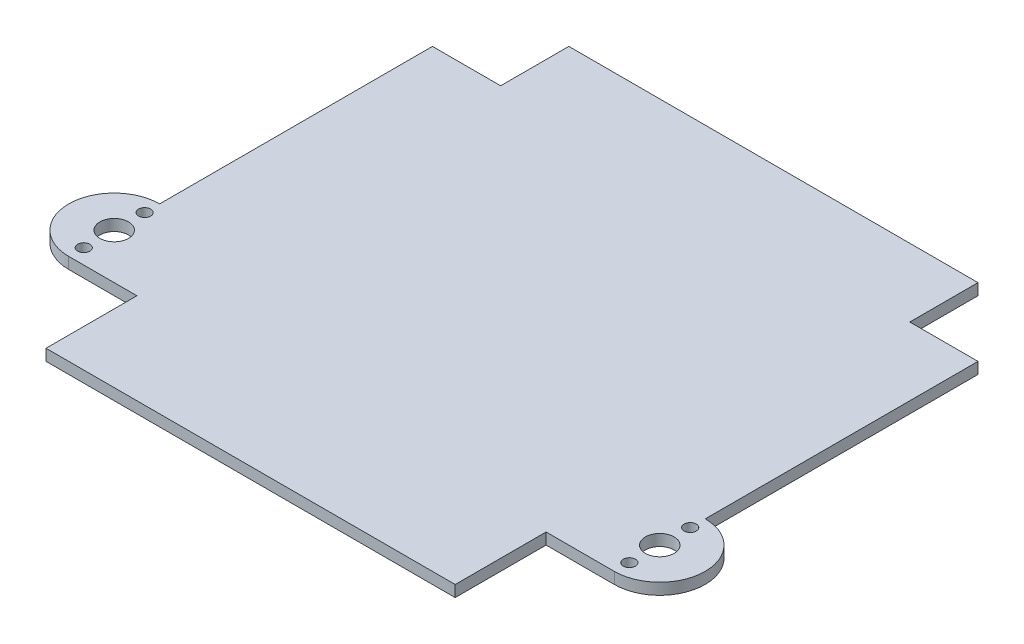
ISO-10303-21;
HEADER;
FILE_DESCRIPTION(('STEP AP214'),'2;1');
FILE_NAME('part.step','',(''),(''),'','','');
FILE_SCHEMA(('AUTOMOTIVE_DESIGN { 1 0 10303 214 1 1 1 1 }'));
ENDSEC;
DATA;
#1=APPLICATION_CONTEXT('core data for automotive mechanical design processes');
#2=APPLICATION_PROTOCOL_DEFINITION('international standard','automotive_design',2000,#1);
#3=PRODUCT_CONTEXT('',#1,'mechanical');
#4=PRODUCT('Part','Part','',(#3));
#5=PRODUCT_RELATED_PRODUCT_CATEGORY('part','',(#4));
#6=PRODUCT_DEFINITION_FORMATION('','',#4);
#7=PRODUCT_DEFINITION_CONTEXT('part definition',#1,'design');
#8=PRODUCT_DEFINITION('design','',#6,#7);
#9=PRODUCT_DEFINITION_SHAPE('','',#8);
#10=(LENGTH_UNIT() NAMED_UNIT(*) SI_UNIT(.MILLI.,.METRE.));
#11=(NAMED_UNIT(*) PLANE_ANGLE_UNIT() SI_UNIT($,.RADIAN.));
#12=(NAMED_UNIT(*) SI_UNIT($,.STERADIAN.) SOLID_ANGLE_UNIT());
#13=UNCERTAINTY_MEASURE_WITH_UNIT(LENGTH_MEASURE(1.E-05),#10,'distance_accuracy_value','');
#14=(GEOMETRIC_REPRESENTATION_CONTEXT(3) GLOBAL_UNCERTAINTY_ASSIGNED_CONTEXT((#13)) GLOBAL_UNIT_ASSIGNED_CONTEXT((#10,
#11,#12)) REPRESENTATION_CONTEXT('',''));
#15=CARTESIAN_POINT('',(0.,0.,0.));
#16=DIRECTION('',(0.,0.,1.));
#17=DIRECTION('',(1.,0.,0.));
#18=AXIS2_PLACEMENT_3D('',#15,#16,#17);
#19=CARTESIAN_POINT('',(0.,3.175,0.));
#20=DIRECTION('',(0.,-1.,0.));
#21=DIRECTION('',(0.,0.,-1.));
#22=AXIS2_PLACEMENT_3D('',#19,#20,#21);
#23=PLANE('',#22);
#24=CARTESIAN_POINT('',(-76.2,3.175,29.6));
#25=DIRECTION('',(0.,1.,0.));
#26=DIRECTION('',(0.,0.,1.));
#27=AXIS2_PLACEMENT_3D('',#24,#25,#26);
#28=CIRCLE('',#27,1.69999999999999);
#29=CARTESIAN_POINT('',(-76.2,3.175,31.3));
#30=VERTEX_POINT('',#29);
#31=EDGE_CURVE('E281',#30,#30,#28,.T.);
#32=ORIENTED_EDGE('',*,*,#31,.F.);
#33=EDGE_LOOP('',(#32));
#34=FACE_BOUND('',#33,.T.);
#35=CARTESIAN_POINT('',(-76.2,3.175,46.6));
#36=DIRECTION('',(0.,1.,0.));
#37=DIRECTION('',(0.,0.,1.));
#38=AXIS2_PLACEMENT_3D('',#35,#36,#37);
#39=CIRCLE('',#38,1.69999999999999);
#40=CARTESIAN_POINT('',(-76.2,3.175,48.3));
#41=VERTEX_POINT('',#40);
#42=EDGE_CURVE('E270',#41,#41,#39,.T.);
#43=ORIENTED_EDGE('',*,*,#42,.F.);
#44=EDGE_LOOP('',(#43));
#45=FACE_BOUND('',#44,.T.);
#46=CARTESIAN_POINT('',(76.2,3.175,29.6));
#47=DIRECTION('',(0.,1.,0.));
#48=DIRECTION('',(0.,0.,1.));
#49=AXIS2_PLACEMENT_3D('',#46,#47,#48);
#50=CIRCLE('',#49,1.69999999999999);
#51=CARTESIAN_POINT('',(76.2,3.175,31.3));
#52=VERTEX_POINT('',#51);
#53=EDGE_CURVE('E269',#52,#52,#50,.T.);
#54=ORIENTED_EDGE('',*,*,#53,.F.);
#55=EDGE_LOOP('',(#54));
#56=FACE_BOUND('',#55,.T.);
#57=DIRECTION('',(0.,0.,1.));
#58=VECTOR('',#57,1.);
#59=CARTESIAN_POINT('',(-57.15,3.175,50.8));
#60=LINE('',#59,#58);
#61=CARTESIAN_POINT('',(-57.15,3.175,-69.85));
#62=VERTEX_POINT('',#61);
#63=CARTESIAN_POINT('',(-57.15,3.175,-50.8));
#64=VERTEX_POINT('',#63);
#65=EDGE_CURVE('E46',#62,#64,#60,.T.);
#66=ORIENTED_EDGE('',*,*,#65,.T.);
#67=DIRECTION('',(-1.,0.,0.));
#68=VECTOR('',#67,1.);
#69=CARTESIAN_POINT('',(0.,3.175,-50.8));
#70=LINE('',#69,#68);
#71=CARTESIAN_POINT('',(-76.2,3.175,-50.8));
#72=VERTEX_POINT('',#71);
#73=EDGE_CURVE('E180',#64,#72,#70,.T.);
#74=ORIENTED_EDGE('',*,*,#73,.T.);
#75=DIRECTION('',(0.,0.,1.));
#76=VECTOR('',#75,1.);
#77=CARTESIAN_POINT('',(-76.2,3.175,0.));
#78=LINE('',#77,#76);
#79=CARTESIAN_POINT('',(-76.2,3.175,25.4));
#80=VERTEX_POINT('',#79);
#81=EDGE_CURVE('E183',#72,#80,#78,.T.);
#82=ORIENTED_EDGE('',*,*,#81,.T.);
#83=CARTESIAN_POINT('',(-76.2,3.175,38.1));
#84=DIRECTION('',(0.,1.,0.));
#85=DIRECTION('',(0.,0.,1.));
#86=AXIS2_PLACEMENT_3D('',#83,#84,#85);
#87=CIRCLE('',#86,12.7);
#88=CARTESIAN_POINT('',(-76.2,3.175,50.8));
#89=VERTEX_POINT('',#88);
#90=EDGE_CURVE('E157',#80,#89,#87,.T.);
#91=ORIENTED_EDGE('',*,*,#90,.T.);
#92=DIRECTION('',(1.,0.,0.));
#93=VECTOR('',#92,1.);
#94=CARTESIAN_POINT('',(0.,3.175,50.8));
#95=LINE('',#94,#93);
#96=CARTESIAN_POINT('',(-57.15,3.175,50.8));
#97=VERTEX_POINT('',#96);
#98=EDGE_CURVE('E186',#89,#97,#95,.T.);
#99=ORIENTED_EDGE('',*,*,#98,.T.);
#100=CARTESIAN_POINT('',(-57.15,3.175,76.2));
#101=VERTEX_POINT('',#100);
#102=EDGE_CURVE('E260',#97,#101,#60,.T.);
#103=ORIENTED_EDGE('',*,*,#102,.T.);
#104=DIRECTION('',(1.,0.,0.));
#105=VECTOR('',#104,1.);
#106=CARTESIAN_POINT('',(0.,3.175,76.2));
#107=LINE('',#106,#105);
#108=CARTESIAN_POINT('',(57.15,3.175,76.2));
#109=VERTEX_POINT('',#108);
#110=EDGE_CURVE('E199',#101,#109,#107,.T.);
#111=ORIENTED_EDGE('',*,*,#110,.T.);
#112=DIRECTION('',(0.,0.,1.));
#113=VECTOR('',#112,1.);
#114=CARTESIAN_POINT('',(57.15,3.175,0.));
#115=LINE('',#114,#113);
#116=CARTESIAN_POINT('',(57.15,3.175,50.8));
#117=VERTEX_POINT('',#116);
#118=EDGE_CURVE('E195',#117,#109,#115,.T.);
#119=ORIENTED_EDGE('',*,*,#118,.F.);
#120=DIRECTION('',(1.,0.,0.));
#121=VECTOR('',#120,1.);
#122=CARTESIAN_POINT('',(-57.15,3.175,50.8));
#123=LINE('',#122,#121);
#124=CARTESIAN_POINT('',(76.2,3.175,50.8));
#125=VERTEX_POINT('',#124);
#126=EDGE_CURVE('E11',#117,#125,#123,.T.);
#127=ORIENTED_EDGE('',*,*,#126,.T.);
#128=CARTESIAN_POINT('',(76.2,3.175,38.1));
#129=DIRECTION('',(0.,1.,0.));
#130=DIRECTION('',(0.,0.,1.));
#131=AXIS2_PLACEMENT_3D('',#128,#129,#130);
#132=CIRCLE('',#131,12.7);
#133=CARTESIAN_POINT('',(76.2,3.175,25.4));
#134=VERTEX_POINT('',#133);
#135=EDGE_CURVE('E221',#134,#125,#132,.F.);
#136=ORIENTED_EDGE('',*,*,#135,.F.);
#137=DIRECTION('',(0.,0.,1.));
#138=VECTOR('',#137,1.);
#139=CARTESIAN_POINT('',(76.2,3.175,0.));
#140=LINE('',#139,#138);
#141=CARTESIAN_POINT('',(76.2,3.175,-50.8));
#142=VERTEX_POINT('',#141);
#143=EDGE_CURVE('E224',#142,#134,#140,.T.);
#144=ORIENTED_EDGE('',*,*,#143,.F.);
#145=DIRECTION('',(1.,0.,0.));
#146=VECTOR('',#145,1.);
#147=CARTESIAN_POINT('',(0.,3.175,-50.8));
#148=LINE('',#147,#146);
#149=CARTESIAN_POINT('',(57.15,3.175,-50.8));
#150=VERTEX_POINT('',#149);
#151=EDGE_CURVE('E228',#150,#142,#148,.T.);
#152=ORIENTED_EDGE('',*,*,#151,.F.);
#153=DIRECTION('',(0.,0.,-1.));
#154=VECTOR('',#153,1.);
#155=CARTESIAN_POINT('',(57.15,3.175,50.8));
#156=LINE('',#155,#154);
#157=CARTESIAN_POINT('',(57.15,3.175,-69.85));
#158=VERTEX_POINT('',#157);
#159=EDGE_CURVE('E258',#150,#158,#156,.T.);
#160=ORIENTED_EDGE('',*,*,#159,.T.);
#161=DIRECTION('',(1.,0.,0.));
#162=VECTOR('',#161,1.);
#163=CARTESIAN_POINT('',(0.,3.175,-69.85));
#164=LINE('',#163,#162);
#165=EDGE_CURVE('E246',#62,#158,#164,.T.);
#166=ORIENTED_EDGE('',*,*,#165,.F.);
#167=EDGE_LOOP('',(#66,#74,#82,#91,#99,#103,#111,#119,#127,#136,#144,#152,#160,#166));
#168=FACE_BOUND('',#167,.T.);
#169=CARTESIAN_POINT('',(76.2,3.175,38.1));
#170=DIRECTION('',(0.,1.,0.));
#171=DIRECTION('',(0.,0.,1.));
#172=AXIS2_PLACEMENT_3D('',#169,#170,#171);
#173=CIRCLE('',#172,4.00000000000001);
#174=CARTESIAN_POINT('',(76.2,3.175,42.1));
#175=VERTEX_POINT('',#174);
#176=EDGE_CURVE('E216',#175,#175,#173,.F.);
#177=ORIENTED_EDGE('',*,*,#176,.T.);
#178=EDGE_LOOP('',(#177));
#179=FACE_BOUND('',#178,.T.);
#180=CARTESIAN_POINT('',(-76.2,3.175,38.1));
#181=DIRECTION('',(0.,1.,0.));
#182=DIRECTION('',(0.,0.,1.));
#183=AXIS2_PLACEMENT_3D('',#180,#181,#182);
#184=CIRCLE('',#183,4.00000000000001);
#185=CARTESIAN_POINT('',(-76.2,3.175,42.1));
#186=VERTEX_POINT('',#185);
#187=EDGE_CURVE('E177',#186,#186,#184,.T.);
#188=ORIENTED_EDGE('',*,*,#187,.F.);
#189=EDGE_LOOP('',(#188));
#190=FACE_BOUND('',#189,.T.);
#191=CARTESIAN_POINT('',(76.2,3.175,46.6));
#192=DIRECTION('',(0.,1.,0.));
#193=DIRECTION('',(0.,0.,1.));
#194=AXIS2_PLACEMENT_3D('',#191,#192,#193);
#195=CIRCLE('',#194,1.69999999999999);
#196=CARTESIAN_POINT('',(76.2,3.175,48.3));
#197=VERTEX_POINT('',#196);
#198=EDGE_CURVE('E285',#197,#197,#195,.T.);
#199=ORIENTED_EDGE('',*,*,#198,.F.);
#200=EDGE_LOOP('',(#199));
#201=FACE_BOUND('',#200,.T.);
#202=ADVANCED_FACE('F37',(#34,#45,#56,#168,#179,#190,#201),#23,.F.);
#203=CARTESIAN_POINT('',(-57.15,3.175,50.8));
#204=DIRECTION('',(1.,0.,0.));
#205=DIRECTION('',(0.,0.,-1.));
#206=AXIS2_PLACEMENT_3D('',#203,#204,#205);
#207=PLANE('',#206);
#208=DIRECTION('',(0.,1.,0.));
#209=VECTOR('',#208,1.);
#210=CARTESIAN_POINT('',(-57.15,-117.08821460762,50.8));
#211=LINE('',#210,#209);
#212=CARTESIAN_POINT('',(-57.15,0.,50.8));
#213=VERTEX_POINT('',#212);
#214=EDGE_CURVE('E62',#213,#97,#211,.T.);
#215=ORIENTED_EDGE('',*,*,#214,.F.);
#216=DIRECTION('',(0.,0.,1.));
#217=VECTOR('',#216,1.);
#218=CARTESIAN_POINT('',(-57.15,0.,50.8));
#219=LINE('',#218,#217);
#220=CARTESIAN_POINT('',(-57.15,0.,76.2));
#221=VERTEX_POINT('',#220);
#222=EDGE_CURVE('E264',#213,#221,#219,.T.);
#223=ORIENTED_EDGE('',*,*,#222,.T.);
#224=DIRECTION('',(0.,1.,0.));
#225=VECTOR('',#224,1.);
#226=CARTESIAN_POINT('',(-57.15,-117.08821460762,76.2));
#227=LINE('',#226,#225);
#228=EDGE_CURVE('E196',#221,#101,#227,.T.);
#229=ORIENTED_EDGE('',*,*,#228,.T.);
#230=ORIENTED_EDGE('',*,*,#102,.F.);
#231=EDGE_LOOP('',(#215,#223,#229,#230));
#232=FACE_BOUND('',#231,.T.);
#233=ADVANCED_FACE('F306',(#232),#207,.F.);
#234=CARTESIAN_POINT('',(-57.15,3.175,50.8));
#235=DIRECTION('',(0.,0.,-1.));
#236=DIRECTION('',(-1.,0.,0.));
#237=AXIS2_PLACEMENT_3D('',#234,#235,#236);
#238=PLANE('',#237);
#239=DIRECTION('',(0.,1.,0.));
#240=VECTOR('',#239,1.);
#241=CARTESIAN_POINT('',(57.15,-117.08821460762,50.8));
#242=LINE('',#241,#240);
#243=CARTESIAN_POINT('',(57.15,0.,50.8));
#244=VERTEX_POINT('',#243);
#245=EDGE_CURVE('E176',#244,#117,#242,.T.);
#246=ORIENTED_EDGE('',*,*,#245,.F.);
#247=DIRECTION('',(1.,0.,0.));
#248=VECTOR('',#247,1.);
#249=CARTESIAN_POINT('',(-57.15,0.,50.8));
#250=LINE('',#249,#248);
#251=CARTESIAN_POINT('',(76.2,0.,50.8));
#252=VERTEX_POINT('',#251);
#253=EDGE_CURVE('E261',#244,#252,#250,.T.);
#254=ORIENTED_EDGE('',*,*,#253,.T.);
#255=DIRECTION('',(0.,1.,0.));
#256=VECTOR('',#255,1.);
#257=CARTESIAN_POINT('',(76.2,-117.08821460762,50.8));
#258=LINE('',#257,#256);
#259=EDGE_CURVE('E206',#252,#125,#258,.T.);
#260=ORIENTED_EDGE('',*,*,#259,.T.);
#261=ORIENTED_EDGE('',*,*,#126,.F.);
#262=EDGE_LOOP('',(#246,#254,#260,#261));
#263=FACE_BOUND('',#262,.T.);
#264=ADVANCED_FACE('F316',(#263),#238,.F.);
#265=CARTESIAN_POINT('',(57.15,3.175,50.8));
#266=DIRECTION('',(-1.,0.,0.));
#267=DIRECTION('',(0.,0.,1.));
#268=AXIS2_PLACEMENT_3D('',#265,#266,#267);
#269=PLANE('',#268);
#270=DIRECTION('',(0.,1.,0.));
#271=VECTOR('',#270,1.);
#272=CARTESIAN_POINT('',(57.15,-117.08821460762,-50.8));
#273=LINE('',#272,#271);
#274=CARTESIAN_POINT('',(57.15,0.,-50.8));
#275=VERTEX_POINT('',#274);
#276=EDGE_CURVE('E225',#275,#150,#273,.T.);
#277=ORIENTED_EDGE('',*,*,#276,.F.);
#278=DIRECTION('',(0.,0.,-1.));
#279=VECTOR('',#278,1.);
#280=CARTESIAN_POINT('',(57.15,0.,50.8));
#281=LINE('',#280,#279);
#282=CARTESIAN_POINT('',(57.15,0.,-69.85));
#283=VERTEX_POINT('',#282);
#284=EDGE_CURVE('E253',#275,#283,#281,.T.);
#285=ORIENTED_EDGE('',*,*,#284,.T.);
#286=DIRECTION('',(0.,1.,0.));
#287=VECTOR('',#286,1.);
#288=CARTESIAN_POINT('',(57.15,-117.08821460762,-69.85));
#289=LINE('',#288,#287);
#290=EDGE_CURVE('E245',#283,#158,#289,.T.);
#291=ORIENTED_EDGE('',*,*,#290,.T.);
#292=ORIENTED_EDGE('',*,*,#159,.F.);
#293=EDGE_LOOP('',(#277,#285,#291,#292));
#294=FACE_BOUND('',#293,.T.);
#295=ADVANCED_FACE('F39',(#294),#269,.F.);
#296=CARTESIAN_POINT('',(-57.15,0.,-69.85));
#297=VERTEX_POINT('',#296);
#298=CARTESIAN_POINT('',(-57.15,0.,-50.8));
#299=VERTEX_POINT('',#298);
#300=EDGE_CURVE('E265',#297,#299,#219,.T.);
#301=ORIENTED_EDGE('',*,*,#300,.T.);
#302=DIRECTION('',(0.,1.,0.));
#303=VECTOR('',#302,1.);
#304=CARTESIAN_POINT('',(-57.15,-117.08821460762,-50.8));
#305=LINE('',#304,#303);
#306=EDGE_CURVE('E54',#299,#64,#305,.T.);
#307=ORIENTED_EDGE('',*,*,#306,.T.);
#308=ORIENTED_EDGE('',*,*,#65,.F.);
#309=DIRECTION('',(0.,1.,0.));
#310=VECTOR('',#309,1.);
#311=CARTESIAN_POINT('',(-57.15,-117.08821460762,-69.85));
#312=LINE('',#311,#310);
#313=EDGE_CURVE('E250',#297,#62,#312,.T.);
#314=ORIENTED_EDGE('',*,*,#313,.F.);
#315=EDGE_LOOP('',(#301,#307,#308,#314));
#316=FACE_BOUND('',#315,.T.);
#317=ADVANCED_FACE('F296',(#316),#207,.F.);
#318=CARTESIAN_POINT('',(0.,0.,0.));
#319=DIRECTION('',(0.,-1.,0.));
#320=DIRECTION('',(0.,0.,-1.));
#321=AXIS2_PLACEMENT_3D('',#318,#319,#320);
#322=PLANE('',#321);
#323=CARTESIAN_POINT('',(-76.2,0.,29.6));
#324=DIRECTION('',(0.,-1.,0.));
#325=DIRECTION('',(0.,0.,-1.));
#326=AXIS2_PLACEMENT_3D('',#323,#324,#325);
#327=CIRCLE('',#326,1.69999999999999);
#328=CARTESIAN_POINT('',(-76.2,0.,27.9));
#329=VERTEX_POINT('',#328);
#330=EDGE_CURVE('E41',#329,#329,#327,.T.);
#331=ORIENTED_EDGE('',*,*,#330,.F.);
#332=EDGE_LOOP('',(#331));
#333=FACE_BOUND('',#332,.T.);
#334=CARTESIAN_POINT('',(-76.2,0.,46.6));
#335=DIRECTION('',(0.,-1.,0.));
#336=DIRECTION('',(0.,0.,-1.));
#337=AXIS2_PLACEMENT_3D('',#334,#335,#336);
#338=CIRCLE('',#337,1.69999999999999);
#339=CARTESIAN_POINT('',(-76.2,0.,44.9));
#340=VERTEX_POINT('',#339);
#341=EDGE_CURVE('E267',#340,#340,#338,.T.);
#342=ORIENTED_EDGE('',*,*,#341,.F.);
#343=EDGE_LOOP('',(#342));
#344=FACE_BOUND('',#343,.T.);
#345=CARTESIAN_POINT('',(76.2,0.,29.6));
#346=DIRECTION('',(0.,-1.,0.));
#347=DIRECTION('',(0.,0.,-1.));
#348=AXIS2_PLACEMENT_3D('',#345,#346,#347);
#349=CIRCLE('',#348,1.69999999999999);
#350=CARTESIAN_POINT('',(76.2,0.,27.9));
#351=VERTEX_POINT('',#350);
#352=EDGE_CURVE('E274',#351,#351,#349,.T.);
#353=ORIENTED_EDGE('',*,*,#352,.F.);
#354=EDGE_LOOP('',(#353));
#355=FACE_BOUND('',#354,.T.);
#356=CARTESIAN_POINT('',(76.2,0.,46.6));
#357=DIRECTION('',(0.,-1.,0.));
#358=DIRECTION('',(0.,0.,-1.));
#359=AXIS2_PLACEMENT_3D('',#356,#357,#358);
#360=CIRCLE('',#359,1.69999999999999);
#361=CARTESIAN_POINT('',(76.2,0.,44.9));
#362=VERTEX_POINT('',#361);
#363=EDGE_CURVE('E169',#362,#362,#360,.T.);
#364=ORIENTED_EDGE('',*,*,#363,.F.);
#365=EDGE_LOOP('',(#364));
#366=FACE_BOUND('',#365,.T.);
#367=ORIENTED_EDGE('',*,*,#284,.F.);
#368=DIRECTION('',(1.,0.,0.));
#369=VECTOR('',#368,1.);
#370=CARTESIAN_POINT('',(0.,0.,-50.8));
#371=LINE('',#370,#369);
#372=CARTESIAN_POINT('',(76.2,0.,-50.8));
#373=VERTEX_POINT('',#372);
#374=EDGE_CURVE('E215',#275,#373,#371,.T.);
#375=ORIENTED_EDGE('',*,*,#374,.T.);
#376=DIRECTION('',(0.,0.,1.));
#377=VECTOR('',#376,1.);
#378=CARTESIAN_POINT('',(76.2,0.,0.));
#379=LINE('',#378,#377);
#380=CARTESIAN_POINT('',(76.2,0.,25.4));
#381=VERTEX_POINT('',#380);
#382=EDGE_CURVE('E239',#373,#381,#379,.T.);
#383=ORIENTED_EDGE('',*,*,#382,.T.);
#384=CARTESIAN_POINT('',(76.2,0.,38.1));
#385=DIRECTION('',(0.,-1.,0.));
#386=DIRECTION('',(0.,0.,-1.));
#387=AXIS2_PLACEMENT_3D('',#384,#385,#386);
#388=CIRCLE('',#387,12.7);
#389=EDGE_CURVE('E242',#381,#252,#388,.T.);
#390=ORIENTED_EDGE('',*,*,#389,.T.);
#391=ORIENTED_EDGE('',*,*,#253,.F.);
#392=DIRECTION('',(0.,0.,1.));
#393=VECTOR('',#392,1.);
#394=CARTESIAN_POINT('',(57.15,0.,0.));
#395=LINE('',#394,#393);
#396=CARTESIAN_POINT('',(57.15,0.,76.2));
#397=VERTEX_POINT('',#396);
#398=EDGE_CURVE('E203',#244,#397,#395,.T.);
#399=ORIENTED_EDGE('',*,*,#398,.T.);
#400=DIRECTION('',(1.,0.,0.));
#401=VECTOR('',#400,1.);
#402=CARTESIAN_POINT('',(0.,0.,76.2));
#403=LINE('',#402,#401);
#404=EDGE_CURVE('E202',#221,#397,#403,.T.);
#405=ORIENTED_EDGE('',*,*,#404,.F.);
#406=ORIENTED_EDGE('',*,*,#222,.F.);
#407=DIRECTION('',(1.,0.,0.));
#408=VECTOR('',#407,1.);
#409=CARTESIAN_POINT('',(0.,0.,50.8));
#410=LINE('',#409,#408);
#411=CARTESIAN_POINT('',(-76.2,0.,50.8));
#412=VERTEX_POINT('',#411);
#413=EDGE_CURVE('E148',#412,#213,#410,.T.);
#414=ORIENTED_EDGE('',*,*,#413,.F.);
#415=CARTESIAN_POINT('',(-76.2,0.,38.1));
#416=DIRECTION('',(0.,-1.,0.));
#417=DIRECTION('',(0.,0.,-1.));
#418=AXIS2_PLACEMENT_3D('',#415,#416,#417);
#419=CIRCLE('',#418,12.7);
#420=CARTESIAN_POINT('',(-76.2,0.,25.4));
#421=VERTEX_POINT('',#420);
#422=EDGE_CURVE('E138',#421,#412,#419,.F.);
#423=ORIENTED_EDGE('',*,*,#422,.F.);
#424=DIRECTION('',(0.,0.,1.));
#425=VECTOR('',#424,1.);
#426=CARTESIAN_POINT('',(-76.2,0.,0.));
#427=LINE('',#426,#425);
#428=CARTESIAN_POINT('',(-76.2,0.,-50.8));
#429=VERTEX_POINT('',#428);
#430=EDGE_CURVE('E145',#429,#421,#427,.T.);
#431=ORIENTED_EDGE('',*,*,#430,.F.);
#432=DIRECTION('',(-1.,0.,0.));
#433=VECTOR('',#432,1.);
#434=CARTESIAN_POINT('',(0.,0.,-50.8));
#435=LINE('',#434,#433);
#436=EDGE_CURVE('E166',#299,#429,#435,.T.);
#437=ORIENTED_EDGE('',*,*,#436,.F.);
#438=ORIENTED_EDGE('',*,*,#300,.F.);
#439=DIRECTION('',(1.,0.,0.));
#440=VECTOR('',#439,1.);
#441=CARTESIAN_POINT('',(0.,0.,-69.85));
#442=LINE('',#441,#440);
#443=EDGE_CURVE('E249',#297,#283,#442,.T.);
#444=ORIENTED_EDGE('',*,*,#443,.T.);
#445=EDGE_LOOP('',(#367,#375,#383,#390,#391,#399,#405,#406,#414,#423,#431,#437,#438,#444));
#446=FACE_BOUND('',#445,.T.);
#447=CARTESIAN_POINT('',(76.2,0.,38.1));
#448=DIRECTION('',(0.,-1.,0.));
#449=DIRECTION('',(0.,0.,-1.));
#450=AXIS2_PLACEMENT_3D('',#447,#448,#449);
#451=CIRCLE('',#450,4.00000000000001);
#452=CARTESIAN_POINT('',(76.2,0.,34.1));
#453=VERTEX_POINT('',#452);
#454=EDGE_CURVE('E212',#453,#453,#451,.T.);
#455=ORIENTED_EDGE('',*,*,#454,.F.);
#456=EDGE_LOOP('',(#455));
#457=FACE_BOUND('',#456,.T.);
#458=CARTESIAN_POINT('',(-76.2,0.,38.1));
#459=DIRECTION('',(0.,-1.,0.));
#460=DIRECTION('',(0.,0.,-1.));
#461=AXIS2_PLACEMENT_3D('',#458,#459,#460);
#462=CIRCLE('',#461,4.00000000000001);
#463=CARTESIAN_POINT('',(-76.2,0.,34.1));
#464=VERTEX_POINT('',#463);
#465=EDGE_CURVE('E173',#464,#464,#462,.F.);
#466=ORIENTED_EDGE('',*,*,#465,.T.);
#467=EDGE_LOOP('',(#466));
#468=FACE_BOUND('',#467,.T.);
#469=ADVANCED_FACE('F141',(#333,#344,#355,#366,#446,#457,#468),#322,.T.);
#470=CARTESIAN_POINT('',(0.,-117.08821460762,-69.85));
#471=DIRECTION('',(0.,0.,1.));
#472=DIRECTION('',(1.,0.,0.));
#473=AXIS2_PLACEMENT_3D('',#470,#471,#472);
#474=PLANE('',#473);
#475=ORIENTED_EDGE('',*,*,#443,.F.);
#476=ORIENTED_EDGE('',*,*,#313,.T.);
#477=ORIENTED_EDGE('',*,*,#165,.T.);
#478=ORIENTED_EDGE('',*,*,#290,.F.);
#479=EDGE_LOOP('',(#475,#476,#477,#478));
#480=FACE_BOUND('',#479,.T.);
#481=ADVANCED_FACE('F295',(#480),#474,.F.);
#482=CARTESIAN_POINT('',(76.2,-117.08821460762,38.1));
#483=DIRECTION('',(0.,1.,0.));
#484=DIRECTION('',(0.,0.,1.));
#485=AXIS2_PLACEMENT_3D('',#482,#483,#484);
#486=CYLINDRICAL_SURFACE('',#485,12.7);
#487=ORIENTED_EDGE('',*,*,#389,.F.);
#488=DIRECTION('',(0.,1.,0.));
#489=VECTOR('',#488,1.);
#490=CARTESIAN_POINT('',(76.2,-117.08821460762,25.4));
#491=LINE('',#490,#489);
#492=EDGE_CURVE('E219',#381,#134,#491,.T.);
#493=ORIENTED_EDGE('',*,*,#492,.T.);
#494=ORIENTED_EDGE('',*,*,#135,.T.);
#495=ORIENTED_EDGE('',*,*,#259,.F.);
#496=EDGE_LOOP('',(#487,#493,#494,#495));
#497=FACE_BOUND('',#496,.T.);
#498=ADVANCED_FACE('F303',(#497),#486,.T.);
#499=CARTESIAN_POINT('',(76.2,-117.08821460762,0.));
#500=DIRECTION('',(-1.,0.,0.));
#501=DIRECTION('',(0.,0.,1.));
#502=AXIS2_PLACEMENT_3D('',#499,#500,#501);
#503=PLANE('',#502);
#504=ORIENTED_EDGE('',*,*,#382,.F.);
#505=DIRECTION('',(0.,1.,0.));
#506=VECTOR('',#505,1.);
#507=CARTESIAN_POINT('',(76.2,-117.08821460762,-50.8));
#508=LINE('',#507,#506);
#509=EDGE_CURVE('E222',#373,#142,#508,.T.);
#510=ORIENTED_EDGE('',*,*,#509,.T.);
#511=ORIENTED_EDGE('',*,*,#143,.T.);
#512=ORIENTED_EDGE('',*,*,#492,.F.);
#513=EDGE_LOOP('',(#504,#510,#511,#512));
#514=FACE_BOUND('',#513,.T.);
#515=ADVANCED_FACE('F328',(#514),#503,.F.);
#516=CARTESIAN_POINT('',(0.,-117.08821460762,-50.8));
#517=DIRECTION('',(0.,0.,1.));
#518=DIRECTION('',(1.,0.,0.));
#519=AXIS2_PLACEMENT_3D('',#516,#517,#518);
#520=PLANE('',#519);
#521=ORIENTED_EDGE('',*,*,#374,.F.);
#522=ORIENTED_EDGE('',*,*,#276,.T.);
#523=ORIENTED_EDGE('',*,*,#151,.T.);
#524=ORIENTED_EDGE('',*,*,#509,.F.);
#525=EDGE_LOOP('',(#521,#522,#523,#524));
#526=FACE_BOUND('',#525,.T.);
#527=ADVANCED_FACE('F324',(#526),#520,.F.);
#528=CARTESIAN_POINT('',(76.2,-117.08821460762,38.1));
#529=DIRECTION('',(0.,1.,0.));
#530=DIRECTION('',(0.,0.,1.));
#531=AXIS2_PLACEMENT_3D('',#528,#529,#530);
#532=CYLINDRICAL_SURFACE('',#531,4.00000000000001);
#533=ORIENTED_EDGE('',*,*,#176,.F.);
#534=EDGE_LOOP('',(#533));
#535=FACE_BOUND('',#534,.T.);
#536=ORIENTED_EDGE('',*,*,#454,.T.);
#537=EDGE_LOOP('',(#536));
#538=FACE_BOUND('',#537,.T.);
#539=ADVANCED_FACE('F320',(#535,#538),#532,.F.);
#540=CARTESIAN_POINT('',(57.15,-117.08821460762,0.));
#541=DIRECTION('',(-1.,0.,0.));
#542=DIRECTION('',(0.,0.,1.));
#543=AXIS2_PLACEMENT_3D('',#540,#541,#542);
#544=PLANE('',#543);
#545=ORIENTED_EDGE('',*,*,#398,.F.);
#546=ORIENTED_EDGE('',*,*,#245,.T.);
#547=ORIENTED_EDGE('',*,*,#118,.T.);
#548=DIRECTION('',(0.,1.,0.));
#549=VECTOR('',#548,1.);
#550=CARTESIAN_POINT('',(57.15,-117.08821460762,76.2));
#551=LINE('',#550,#549);
#552=EDGE_CURVE('E200',#397,#109,#551,.T.);
#553=ORIENTED_EDGE('',*,*,#552,.F.);
#554=EDGE_LOOP('',(#545,#546,#547,#553));
#555=FACE_BOUND('',#554,.T.);
#556=ADVANCED_FACE('F323',(#555),#544,.F.);
#557=CARTESIAN_POINT('',(0.,-117.08821460762,76.2));
#558=DIRECTION('',(0.,0.,1.));
#559=DIRECTION('',(1.,0.,0.));
#560=AXIS2_PLACEMENT_3D('',#557,#558,#559);
#561=PLANE('',#560);
#562=ORIENTED_EDGE('',*,*,#228,.F.);
#563=ORIENTED_EDGE('',*,*,#404,.T.);
#564=ORIENTED_EDGE('',*,*,#552,.T.);
#565=ORIENTED_EDGE('',*,*,#110,.F.);
#566=EDGE_LOOP('',(#562,#563,#564,#565));
#567=FACE_BOUND('',#566,.T.);
#568=ADVANCED_FACE('F336',(#567),#561,.T.);
#569=CARTESIAN_POINT('',(-76.2,-117.08821460762,38.1));
#570=DIRECTION('',(0.,1.,0.));
#571=DIRECTION('',(0.,0.,1.));
#572=AXIS2_PLACEMENT_3D('',#569,#570,#571);
#573=CYLINDRICAL_SURFACE('',#572,4.00000000000001);
#574=ORIENTED_EDGE('',*,*,#187,.T.);
#575=EDGE_LOOP('',(#574));
#576=FACE_BOUND('',#575,.T.);
#577=ORIENTED_EDGE('',*,*,#465,.F.);
#578=EDGE_LOOP('',(#577));
#579=FACE_BOUND('',#578,.T.);
#580=ADVANCED_FACE('F339',(#576,#579),#573,.F.);
#581=CARTESIAN_POINT('',(0.,-117.08821460762,-50.8));
#582=DIRECTION('',(0.,0.,-1.));
#583=DIRECTION('',(-1.,0.,0.));
#584=AXIS2_PLACEMENT_3D('',#581,#582,#583);
#585=PLANE('',#584);
#586=ORIENTED_EDGE('',*,*,#306,.F.);
#587=ORIENTED_EDGE('',*,*,#436,.T.);
#588=DIRECTION('',(0.,1.,0.));
#589=VECTOR('',#588,1.);
#590=CARTESIAN_POINT('',(-76.2,-117.08821460762,-50.8));
#591=LINE('',#590,#589);
#592=EDGE_CURVE('E163',#429,#72,#591,.T.);
#593=ORIENTED_EDGE('',*,*,#592,.T.);
#594=ORIENTED_EDGE('',*,*,#73,.F.);
#595=EDGE_LOOP('',(#586,#587,#593,#594));
#596=FACE_BOUND('',#595,.T.);
#597=ADVANCED_FACE('F346',(#596),#585,.T.);
#598=CARTESIAN_POINT('',(-76.2,-117.08821460762,0.));
#599=DIRECTION('',(-1.,0.,0.));
#600=DIRECTION('',(0.,0.,1.));
#601=AXIS2_PLACEMENT_3D('',#598,#599,#600);
#602=PLANE('',#601);
#603=ORIENTED_EDGE('',*,*,#592,.F.);
#604=ORIENTED_EDGE('',*,*,#430,.T.);
#605=DIRECTION('',(0.,1.,0.));
#606=VECTOR('',#605,1.);
#607=CARTESIAN_POINT('',(-76.2,-117.08821460762,25.4));
#608=LINE('',#607,#606);
#609=EDGE_CURVE('E152',#421,#80,#608,.T.);
#610=ORIENTED_EDGE('',*,*,#609,.T.);
#611=ORIENTED_EDGE('',*,*,#81,.F.);
#612=EDGE_LOOP('',(#603,#604,#610,#611));
#613=FACE_BOUND('',#612,.T.);
#614=ADVANCED_FACE('F162',(#613),#602,.T.);
#615=CARTESIAN_POINT('',(-76.2,-117.08821460762,38.1));
#616=DIRECTION('',(0.,1.,0.));
#617=DIRECTION('',(0.,0.,1.));
#618=AXIS2_PLACEMENT_3D('',#615,#616,#617);
#619=CYLINDRICAL_SURFACE('',#618,12.7);
#620=ORIENTED_EDGE('',*,*,#609,.F.);
#621=ORIENTED_EDGE('',*,*,#422,.T.);
#622=DIRECTION('',(0.,1.,0.));
#623=VECTOR('',#622,1.);
#624=CARTESIAN_POINT('',(-76.2,-117.08821460762,50.8));
#625=LINE('',#624,#623);
#626=EDGE_CURVE('E151',#412,#89,#625,.T.);
#627=ORIENTED_EDGE('',*,*,#626,.T.);
#628=ORIENTED_EDGE('',*,*,#90,.F.);
#629=EDGE_LOOP('',(#620,#621,#627,#628));
#630=FACE_BOUND('',#629,.T.);
#631=ADVANCED_FACE('F155',(#630),#619,.T.);
#632=CARTESIAN_POINT('',(0.,-117.08821460762,50.8));
#633=DIRECTION('',(0.,0.,1.));
#634=DIRECTION('',(1.,0.,0.));
#635=AXIS2_PLACEMENT_3D('',#632,#633,#634);
#636=PLANE('',#635);
#637=ORIENTED_EDGE('',*,*,#626,.F.);
#638=ORIENTED_EDGE('',*,*,#413,.T.);
#639=ORIENTED_EDGE('',*,*,#214,.T.);
#640=ORIENTED_EDGE('',*,*,#98,.F.);
#641=EDGE_LOOP('',(#637,#638,#639,#640));
#642=FACE_BOUND('',#641,.T.);
#643=ADVANCED_FACE('F355',(#642),#636,.T.);
#644=CARTESIAN_POINT('',(76.2,3.175,46.6));
#645=DIRECTION('',(0.,1.,0.));
#646=DIRECTION('',(0.,0.,1.));
#647=AXIS2_PLACEMENT_3D('',#644,#645,#646);
#648=CYLINDRICAL_SURFACE('',#647,1.69999999999999);
#649=ORIENTED_EDGE('',*,*,#363,.T.);
#650=EDGE_LOOP('',(#649));
#651=FACE_BOUND('',#650,.T.);
#652=ORIENTED_EDGE('',*,*,#198,.T.);
#653=EDGE_LOOP('',(#652));
#654=FACE_BOUND('',#653,.T.);
#655=ADVANCED_FACE('F292',(#651,#654),#648,.F.);
#656=CARTESIAN_POINT('',(76.2,3.175,29.6));
#657=DIRECTION('',(0.,1.,0.));
#658=DIRECTION('',(0.,0.,1.));
#659=AXIS2_PLACEMENT_3D('',#656,#657,#658);
#660=CYLINDRICAL_SURFACE('',#659,1.69999999999999);
#661=ORIENTED_EDGE('',*,*,#352,.T.);
#662=EDGE_LOOP('',(#661));
#663=FACE_BOUND('',#662,.T.);
#664=ORIENTED_EDGE('',*,*,#53,.T.);
#665=EDGE_LOOP('',(#664));
#666=FACE_BOUND('',#665,.T.);
#667=ADVANCED_FACE('F361',(#663,#666),#660,.F.);
#668=CARTESIAN_POINT('',(-76.2,3.175,46.6));
#669=DIRECTION('',(0.,1.,0.));
#670=DIRECTION('',(0.,0.,1.));
#671=AXIS2_PLACEMENT_3D('',#668,#669,#670);
#672=CYLINDRICAL_SURFACE('',#671,1.69999999999999);
#673=ORIENTED_EDGE('',*,*,#341,.T.);
#674=EDGE_LOOP('',(#673));
#675=FACE_BOUND('',#674,.T.);
#676=ORIENTED_EDGE('',*,*,#42,.T.);
#677=EDGE_LOOP('',(#676));
#678=FACE_BOUND('',#677,.T.);
#679=ADVANCED_FACE('F364',(#675,#678),#672,.F.);
#680=CARTESIAN_POINT('',(-76.2,3.175,29.6));
#681=DIRECTION('',(0.,1.,0.));
#682=DIRECTION('',(0.,0.,1.));
#683=AXIS2_PLACEMENT_3D('',#680,#681,#682);
#684=CYLINDRICAL_SURFACE('',#683,1.69999999999999);
#685=ORIENTED_EDGE('',*,*,#330,.T.);
#686=EDGE_LOOP('',(#685));
#687=FACE_BOUND('',#686,.T.);
#688=ORIENTED_EDGE('',*,*,#31,.T.);
#689=EDGE_LOOP('',(#688));
#690=FACE_BOUND('',#689,.T.);
#691=ADVANCED_FACE('F368',(#687,#690),#684,.F.);
#692=CLOSED_SHELL('',(#202,#233,#264,#295,#317,#469,#481,#498,#515,#527,#539,#556,#568,#580,
#597,#614,#631,#643,#655,#667,#679,#691));
#693=MANIFOLD_SOLID_BREP('B2',#692);
#694=ADVANCED_BREP_SHAPE_REPRESENTATION('',(#18,#693),#14);
#695=SHAPE_DEFINITION_REPRESENTATION(#9,#694);
ENDSEC;
END-ISO-10303-21;
